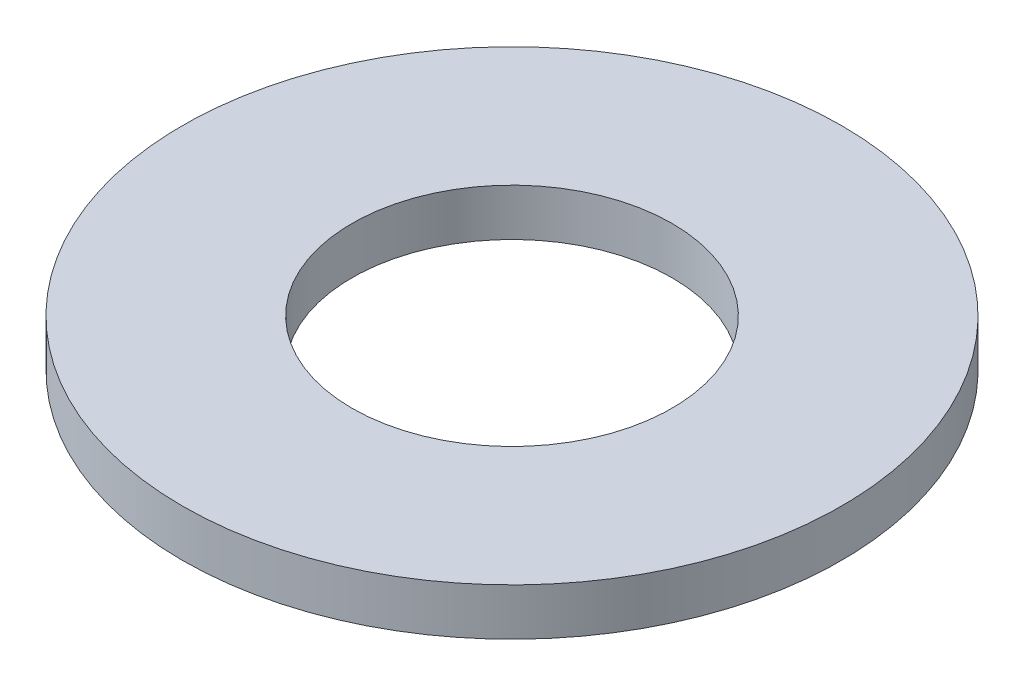
ISO-10303-21;
HEADER;
FILE_DESCRIPTION(('STEP AP214'),'2;1');
FILE_NAME('part.step','',(''),(''),'','','');
FILE_SCHEMA(('AUTOMOTIVE_DESIGN { 1 0 10303 214 1 1 1 1 }'));
ENDSEC;
DATA;
#1=APPLICATION_CONTEXT('core data for automotive mechanical design processes');
#2=APPLICATION_PROTOCOL_DEFINITION('international standard','automotive_design',2000,#1);
#3=PRODUCT_CONTEXT('',#1,'mechanical');
#4=PRODUCT('Part','Part','',(#3));
#5=PRODUCT_RELATED_PRODUCT_CATEGORY('part','',(#4));
#6=PRODUCT_DEFINITION_FORMATION('','',#4);
#7=PRODUCT_DEFINITION_CONTEXT('part definition',#1,'design');
#8=PRODUCT_DEFINITION('design','',#6,#7);
#9=PRODUCT_DEFINITION_SHAPE('','',#8);
#10=(LENGTH_UNIT() NAMED_UNIT(*) SI_UNIT(.MILLI.,.METRE.));
#11=(NAMED_UNIT(*) PLANE_ANGLE_UNIT() SI_UNIT($,.RADIAN.));
#12=(NAMED_UNIT(*) SI_UNIT($,.STERADIAN.) SOLID_ANGLE_UNIT());
#13=UNCERTAINTY_MEASURE_WITH_UNIT(LENGTH_MEASURE(1.E-05),#10,'distance_accuracy_value','');
#14=(GEOMETRIC_REPRESENTATION_CONTEXT(3) GLOBAL_UNCERTAINTY_ASSIGNED_CONTEXT((#13)) GLOBAL_UNIT_ASSIGNED_CONTEXT((#10,
#11,#12)) REPRESENTATION_CONTEXT('',''));
#15=CARTESIAN_POINT('',(0.,0.,0.));
#16=DIRECTION('',(0.,0.,1.));
#17=DIRECTION('',(1.,0.,0.));
#18=AXIS2_PLACEMENT_3D('',#15,#16,#17);
#19=CARTESIAN_POINT('',(-56.2916512459885,157.5,50.));
#20=DIRECTION('',(0.,1.,0.));
#21=DIRECTION('',(0.,0.,1.));
#22=AXIS2_PLACEMENT_3D('',#19,#20,#21);
#23=PLANE('',#22);
#24=CARTESIAN_POINT('',(-56.2916512459885,157.5,50.));
#25=DIRECTION('',(0.,1.,0.));
#26=DIRECTION('',(0.,0.,1.));
#27=AXIS2_PLACEMENT_3D('',#24,#25,#26);
#28=CIRCLE('',#27,3.5);
#29=CARTESIAN_POINT('',(-56.2916512459885,157.5,53.5));
#30=VERTEX_POINT('',#29);
#31=EDGE_CURVE('E10',#30,#30,#28,.T.);
#32=ORIENTED_EDGE('',*,*,#31,.T.);
#33=EDGE_LOOP('',(#32));
#34=FACE_BOUND('',#33,.T.);
#35=CARTESIAN_POINT('',(-56.2916512459885,157.5,50.));
#36=DIRECTION('',(0.,1.,0.));
#37=DIRECTION('',(0.,0.,1.));
#38=AXIS2_PLACEMENT_3D('',#35,#36,#37);
#39=CIRCLE('',#38,1.7);
#40=CARTESIAN_POINT('',(-56.2916512459885,157.5,51.7));
#41=VERTEX_POINT('',#40);
#42=EDGE_CURVE('E49',#41,#41,#39,.T.);
#43=ORIENTED_EDGE('',*,*,#42,.F.);
#44=EDGE_LOOP('',(#43));
#45=FACE_BOUND('',#44,.T.);
#46=ADVANCED_FACE('F39',(#34,#45),#23,.T.);
#47=CARTESIAN_POINT('',(-56.2916512459885,157.,50.));
#48=DIRECTION('',(0.,1.,0.));
#49=DIRECTION('',(0.,0.,1.));
#50=AXIS2_PLACEMENT_3D('',#47,#48,#49);
#51=PLANE('',#50);
#52=CARTESIAN_POINT('',(-56.2916512459885,157.,50.));
#53=DIRECTION('',(0.,1.,0.));
#54=DIRECTION('',(0.,0.,1.));
#55=AXIS2_PLACEMENT_3D('',#52,#53,#54);
#56=CIRCLE('',#55,3.5);
#57=CARTESIAN_POINT('',(-56.2916512459885,157.,53.5));
#58=VERTEX_POINT('',#57);
#59=EDGE_CURVE('E43',#58,#58,#56,.T.);
#60=ORIENTED_EDGE('',*,*,#59,.F.);
#61=EDGE_LOOP('',(#60));
#62=FACE_BOUND('',#61,.T.);
#63=CARTESIAN_POINT('',(-56.2916512459885,157.,50.));
#64=DIRECTION('',(0.,1.,0.));
#65=DIRECTION('',(0.,0.,1.));
#66=AXIS2_PLACEMENT_3D('',#63,#64,#65);
#67=CIRCLE('',#66,1.7);
#68=CARTESIAN_POINT('',(-56.2916512459885,157.,51.7));
#69=VERTEX_POINT('',#68);
#70=EDGE_CURVE('E55',#69,#69,#67,.T.);
#71=ORIENTED_EDGE('',*,*,#70,.T.);
#72=EDGE_LOOP('',(#71));
#73=FACE_BOUND('',#72,.T.);
#74=ADVANCED_FACE('F65',(#62,#73),#51,.F.);
#75=CARTESIAN_POINT('',(-56.2916512459885,157.5,50.));
#76=DIRECTION('',(0.,-1.,0.));
#77=DIRECTION('',(0.,0.,-1.));
#78=AXIS2_PLACEMENT_3D('',#75,#76,#77);
#79=CYLINDRICAL_SURFACE('',#78,3.5);
#80=ORIENTED_EDGE('',*,*,#31,.F.);
#81=EDGE_LOOP('',(#80));
#82=FACE_BOUND('',#81,.T.);
#83=ORIENTED_EDGE('',*,*,#59,.T.);
#84=EDGE_LOOP('',(#83));
#85=FACE_BOUND('',#84,.T.);
#86=ADVANCED_FACE('F41',(#82,#85),#79,.T.);
#87=CARTESIAN_POINT('',(-56.2916512459885,157.5,50.));
#88=DIRECTION('',(0.,-1.,0.));
#89=DIRECTION('',(0.,0.,-1.));
#90=AXIS2_PLACEMENT_3D('',#87,#88,#89);
#91=CYLINDRICAL_SURFACE('',#90,1.7);
#92=ORIENTED_EDGE('',*,*,#42,.T.);
#93=EDGE_LOOP('',(#92));
#94=FACE_BOUND('',#93,.T.);
#95=ORIENTED_EDGE('',*,*,#70,.F.);
#96=EDGE_LOOP('',(#95));
#97=FACE_BOUND('',#96,.T.);
#98=ADVANCED_FACE('F59',(#94,#97),#91,.F.);
#99=CLOSED_SHELL('',(#46,#74,#86,#98));
#100=MANIFOLD_SOLID_BREP('B2',#99);
#101=ADVANCED_BREP_SHAPE_REPRESENTATION('',(#18,#100),#14);
#102=SHAPE_DEFINITION_REPRESENTATION(#9,#101);
ENDSEC;
END-ISO-10303-21;
